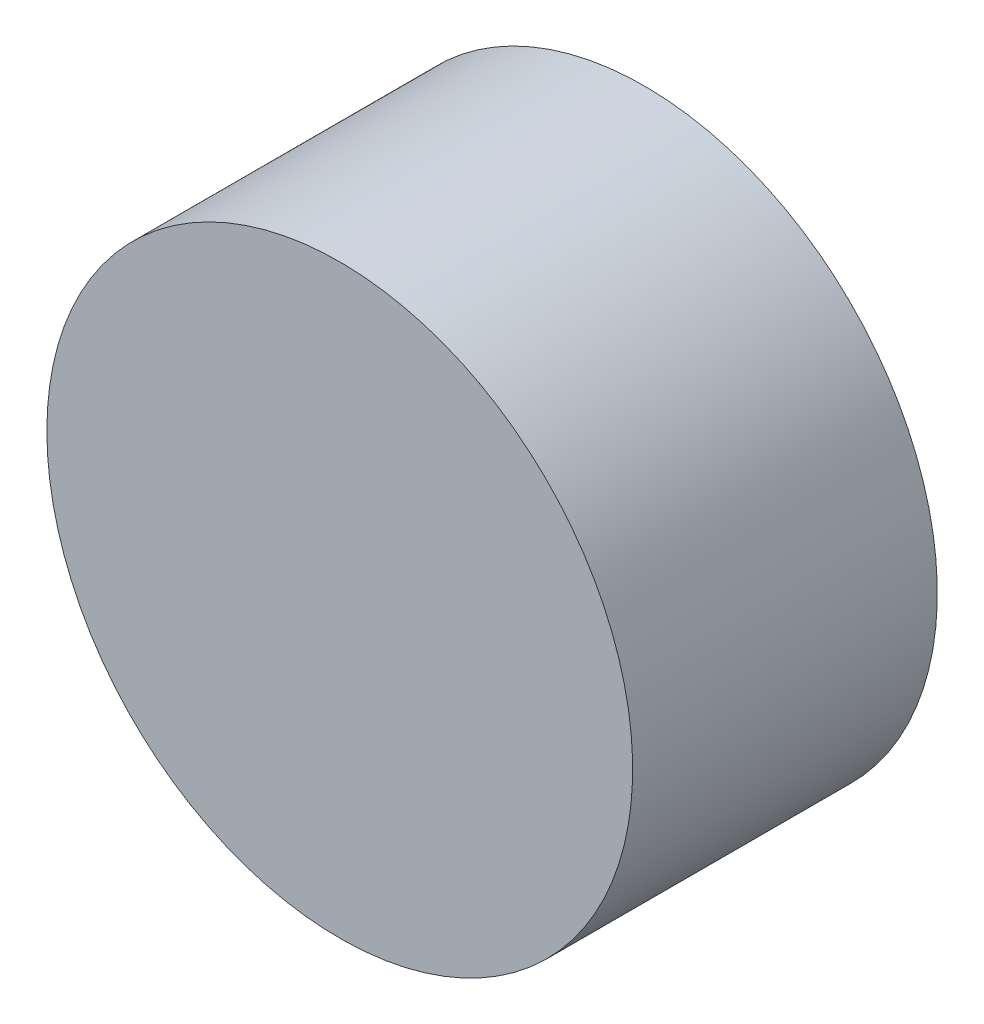
ISO-10303-21;
HEADER;
FILE_DESCRIPTION(('STEP AP214'),'2;1');
FILE_NAME('part.step','',(''),(''),'','','');
FILE_SCHEMA(('AUTOMOTIVE_DESIGN { 1 0 10303 214 1 1 1 1 }'));
ENDSEC;
DATA;
#1=APPLICATION_CONTEXT('core data for automotive mechanical design processes');
#2=APPLICATION_PROTOCOL_DEFINITION('international standard','automotive_design',2000,#1);
#3=PRODUCT_CONTEXT('',#1,'mechanical');
#4=PRODUCT('Part','Part','',(#3));
#5=PRODUCT_RELATED_PRODUCT_CATEGORY('part','',(#4));
#6=PRODUCT_DEFINITION_FORMATION('','',#4);
#7=PRODUCT_DEFINITION_CONTEXT('part definition',#1,'design');
#8=PRODUCT_DEFINITION('design','',#6,#7);
#9=PRODUCT_DEFINITION_SHAPE('','',#8);
#10=(LENGTH_UNIT() NAMED_UNIT(*) SI_UNIT(.MILLI.,.METRE.));
#11=(NAMED_UNIT(*) PLANE_ANGLE_UNIT() SI_UNIT($,.RADIAN.));
#12=(NAMED_UNIT(*) SI_UNIT($,.STERADIAN.) SOLID_ANGLE_UNIT());
#13=UNCERTAINTY_MEASURE_WITH_UNIT(LENGTH_MEASURE(1.E-05),#10,'distance_accuracy_value','');
#14=(GEOMETRIC_REPRESENTATION_CONTEXT(3) GLOBAL_UNCERTAINTY_ASSIGNED_CONTEXT((#13)) GLOBAL_UNIT_ASSIGNED_CONTEXT((#10,
#11,#12)) REPRESENTATION_CONTEXT('',''));
#15=CARTESIAN_POINT('',(0.,0.,0.));
#16=DIRECTION('',(0.,0.,1.));
#17=DIRECTION('',(1.,0.,0.));
#18=AXIS2_PLACEMENT_3D('',#15,#16,#17);
#19=CARTESIAN_POINT('',(0.,0.,13.));
#20=DIRECTION('',(0.,0.,-1.));
#21=DIRECTION('',(-1.,0.,0.));
#22=AXIS2_PLACEMENT_3D('',#19,#20,#21);
#23=CYLINDRICAL_SURFACE('',#22,12.5);
#24=CARTESIAN_POINT('',(0.,0.,13.));
#25=DIRECTION('',(0.,0.,1.));
#26=DIRECTION('',(1.,0.,0.));
#27=AXIS2_PLACEMENT_3D('',#24,#25,#26);
#28=CIRCLE('',#27,12.5);
#29=CARTESIAN_POINT('',(-12.5,0.,13.));
#30=VERTEX_POINT('',#29);
#31=EDGE_CURVE('E10',#30,#30,#28,.T.);
#32=CARTESIAN_POINT('',(0.,0.,0.));
#33=DIRECTION('',(0.,0.,1.));
#34=DIRECTION('',(1.,0.,0.));
#35=AXIS2_PLACEMENT_3D('',#32,#33,#34);
#36=CIRCLE('',#35,12.5);
#37=CARTESIAN_POINT('',(-12.5,0.,0.));
#38=VERTEX_POINT('',#37);
#39=EDGE_CURVE('E41',#38,#38,#36,.T.);
#40=CARTESIAN_POINT('',(-12.5,0.,13.));
#41=CARTESIAN_POINT('',(-12.5,0.,12.8645833333333));
#42=CARTESIAN_POINT('',(-12.5,0.,12.7291666666667));
#43=CARTESIAN_POINT('',(-12.5,0.,12.4583333333333));
#44=CARTESIAN_POINT('',(-12.5,0.,12.3229166666667));
#45=CARTESIAN_POINT('',(-12.5,0.,12.0520833333333));
#46=CARTESIAN_POINT('',(-12.5,0.,11.9166666666667));
#47=CARTESIAN_POINT('',(-12.5,0.,11.6458333333333));
#48=CARTESIAN_POINT('',(-12.5,0.,11.5104166666667));
#49=CARTESIAN_POINT('',(-12.5,0.,11.2395833333333));
#50=CARTESIAN_POINT('',(-12.5,0.,11.1041666666667));
#51=CARTESIAN_POINT('',(-12.5,0.,10.8333333333333));
#52=CARTESIAN_POINT('',(-12.5,0.,10.6979166666667));
#53=CARTESIAN_POINT('',(-12.5,0.,10.4270833333333));
#54=CARTESIAN_POINT('',(-12.5,0.,10.2916666666667));
#55=CARTESIAN_POINT('',(-12.5,0.,10.0208333333333));
#56=CARTESIAN_POINT('',(-12.5,0.,9.88541666666667));
#57=CARTESIAN_POINT('',(-12.5,0.,9.61458333333333));
#58=CARTESIAN_POINT('',(-12.5,0.,9.47916666666667));
#59=CARTESIAN_POINT('',(-12.5,0.,9.20833333333333));
#60=CARTESIAN_POINT('',(-12.5,0.,9.07291666666666));
#61=CARTESIAN_POINT('',(-12.5,0.,8.80208333333333));
#62=CARTESIAN_POINT('',(-12.5,0.,8.66666666666667));
#63=CARTESIAN_POINT('',(-12.5,0.,8.39583333333333));
#64=CARTESIAN_POINT('',(-12.5,0.,8.26041666666667));
#65=CARTESIAN_POINT('',(-12.5,0.,7.98958333333333));
#66=CARTESIAN_POINT('',(-12.5,0.,7.85416666666667));
#67=CARTESIAN_POINT('',(-12.5,0.,7.58333333333333));
#68=CARTESIAN_POINT('',(-12.5,0.,7.44791666666667));
#69=CARTESIAN_POINT('',(-12.5,0.,7.17708333333333));
#70=CARTESIAN_POINT('',(-12.5,0.,7.04166666666667));
#71=CARTESIAN_POINT('',(-12.5,0.,6.77083333333333));
#72=CARTESIAN_POINT('',(-12.5,0.,6.63541666666667));
#73=CARTESIAN_POINT('',(-12.5,0.,6.36458333333333));
#74=CARTESIAN_POINT('',(-12.5,0.,6.22916666666667));
#75=CARTESIAN_POINT('',(-12.5,0.,5.95833333333333));
#76=CARTESIAN_POINT('',(-12.5,0.,5.82291666666667));
#77=CARTESIAN_POINT('',(-12.5,0.,5.55208333333333));
#78=CARTESIAN_POINT('',(-12.5,0.,5.41666666666667));
#79=CARTESIAN_POINT('',(-12.5,0.,5.14583333333333));
#80=CARTESIAN_POINT('',(-12.5,0.,5.01041666666667));
#81=CARTESIAN_POINT('',(-12.5,0.,4.73958333333333));
#82=CARTESIAN_POINT('',(-12.5,0.,4.60416666666667));
#83=CARTESIAN_POINT('',(-12.5,0.,4.33333333333333));
#84=CARTESIAN_POINT('',(-12.5,0.,4.19791666666667));
#85=CARTESIAN_POINT('',(-12.5,0.,3.92708333333333));
#86=CARTESIAN_POINT('',(-12.5,0.,3.79166666666667));
#87=CARTESIAN_POINT('',(-12.5,0.,3.52083333333333));
#88=CARTESIAN_POINT('',(-12.5,0.,3.38541666666667));
#89=CARTESIAN_POINT('',(-12.5,0.,3.11458333333333));
#90=CARTESIAN_POINT('',(-12.5,0.,2.97916666666667));
#91=CARTESIAN_POINT('',(-12.5,0.,2.70833333333333));
#92=CARTESIAN_POINT('',(-12.5,0.,2.57291666666667));
#93=CARTESIAN_POINT('',(-12.5,0.,2.30208333333333));
#94=CARTESIAN_POINT('',(-12.5,0.,2.16666666666667));
#95=CARTESIAN_POINT('',(-12.5,0.,1.89583333333333));
#96=CARTESIAN_POINT('',(-12.5,0.,1.76041666666667));
#97=CARTESIAN_POINT('',(-12.5,0.,1.48958333333333));
#98=CARTESIAN_POINT('',(-12.5,0.,1.35416666666667));
#99=CARTESIAN_POINT('',(-12.5,0.,1.08333333333333));
#100=CARTESIAN_POINT('',(-12.5,0.,0.947916666666667));
#101=CARTESIAN_POINT('',(-12.5,0.,0.677083333333334));
#102=CARTESIAN_POINT('',(-12.5,0.,0.541666666666667));
#103=CARTESIAN_POINT('',(-12.5,0.,0.270833333333334));
#104=CARTESIAN_POINT('',(-12.5,0.,0.135416666666667));
#105=CARTESIAN_POINT('',(-12.5,0.,0.));
#106=B_SPLINE_CURVE_WITH_KNOTS('',3,(#40,#41,#42,#43,#44,#45,#46,#47,#48,#49,#50,#51,#52,#53,
#54,#55,#56,#57,#58,#59,#60,#61,#62,#63,#64,#65,#66,#67,#68,#69,#70,#71,#72,#73,#74,#75,#76,#77,
#78,#79,#80,#81,#82,#83,#84,#85,#86,#87,#88,#89,#90,#91,#92,#93,#94,#95,#96,#97,#98,#99,#100,
#101,#102,#103,#104,#105),.UNSPECIFIED.,.F.,.F.,(4,2,2,2,2,2,2,2,2,2,2,2,2,2,2,2,2,2,2,2,2,2,2,
2,2,2,2,2,2,2,2,2,4),(0.,0.40625,0.812500000000001,1.21875,1.625,2.03125,2.4375,2.84375,3.25,
3.65625,4.0625,4.46875,4.875,5.28125,5.6875,6.09375,6.5,6.90625,7.3125,7.71875,8.125,8.53125,
8.9375,9.34375,9.75,10.15625,10.5625,10.96875,11.375,11.78125,12.1875,12.59375,13.),.UNSPECIFIED.);
#107=EDGE_CURVE('BSEAM38',#30,#38,#106,.T.);
#108=ORIENTED_EDGE('',*,*,#31,.F.);
#109=ORIENTED_EDGE('',*,*,#39,.T.);
#110=ORIENTED_EDGE('',*,*,#107,.T.);
#111=ORIENTED_EDGE('',*,*,#107,.F.);
#112=EDGE_LOOP('',(#108,#110,#109,#111));
#113=FACE_BOUND('',#112,.T.);
#114=ADVANCED_FACE('F38',(#113),#23,.T.);
#115=CARTESIAN_POINT('',(0.,0.,13.));
#116=DIRECTION('',(0.,0.,1.));
#117=DIRECTION('',(1.,0.,0.));
#118=AXIS2_PLACEMENT_3D('',#115,#116,#117);
#119=PLANE('',#118);
#120=ORIENTED_EDGE('',*,*,#31,.T.);
#121=EDGE_LOOP('',(#120));
#122=FACE_BOUND('',#121,.T.);
#123=ADVANCED_FACE('F67',(#122),#119,.T.);
#124=CARTESIAN_POINT('',(0.,0.,0.));
#125=DIRECTION('',(0.,0.,1.));
#126=DIRECTION('',(1.,0.,0.));
#127=AXIS2_PLACEMENT_3D('',#124,#125,#126);
#128=PLANE('',#127);
#129=CARTESIAN_POINT('',(0.,0.,0.));
#130=DIRECTION('',(0.,0.,-1.));
#131=DIRECTION('',(-1.,0.,0.));
#132=AXIS2_PLACEMENT_3D('',#129,#130,#131);
#133=CIRCLE('',#132,3.175);
#134=CARTESIAN_POINT('',(-3.175,0.,0.));
#135=VERTEX_POINT('',#134);
#136=EDGE_CURVE('E50',#135,#135,#133,.T.);
#137=ORIENTED_EDGE('',*,*,#136,.F.);
#138=EDGE_LOOP('',(#137));
#139=FACE_BOUND('',#138,.T.);
#140=ORIENTED_EDGE('',*,*,#39,.F.);
#141=EDGE_LOOP('',(#140));
#142=FACE_BOUND('',#141,.T.);
#143=ADVANCED_FACE('F61',(#139,#142),#128,.F.);
#144=CARTESIAN_POINT('',(0.,0.,12.));
#145=DIRECTION('',(0.,0.,-1.));
#146=DIRECTION('',(-1.,0.,0.));
#147=AXIS2_PLACEMENT_3D('',#144,#145,#146);
#148=CYLINDRICAL_SURFACE('',#147,3.175);
#149=CARTESIAN_POINT('',(0.,0.,12.));
#150=DIRECTION('',(0.,0.,-1.));
#151=DIRECTION('',(-1.,0.,0.));
#152=AXIS2_PLACEMENT_3D('',#149,#150,#151);
#153=CIRCLE('',#152,3.175);
#154=CARTESIAN_POINT('',(-3.175,0.,12.));
#155=VERTEX_POINT('',#154);
#156=EDGE_CURVE('E48',#155,#155,#153,.T.);
#157=ORIENTED_EDGE('',*,*,#156,.F.);
#158=EDGE_LOOP('',(#157));
#159=FACE_BOUND('',#158,.T.);
#160=ORIENTED_EDGE('',*,*,#136,.T.);
#161=EDGE_LOOP('',(#160));
#162=FACE_BOUND('',#161,.T.);
#163=ADVANCED_FACE('F58',(#159,#162),#148,.F.);
#164=CARTESIAN_POINT('',(0.,0.,12.));
#165=DIRECTION('',(0.,0.,-1.));
#166=DIRECTION('',(-1.,0.,0.));
#167=AXIS2_PLACEMENT_3D('',#164,#165,#166);
#168=PLANE('',#167);
#169=ORIENTED_EDGE('',*,*,#156,.T.);
#170=EDGE_LOOP('',(#169));
#171=FACE_BOUND('',#170,.T.);
#172=ADVANCED_FACE('F56',(#171),#168,.T.);
#173=CLOSED_SHELL('',(#114,#123,#143,#163,#172));
#174=MANIFOLD_SOLID_BREP('B2',#173);
#175=ADVANCED_BREP_SHAPE_REPRESENTATION('',(#18,#174),#14);
#176=SHAPE_DEFINITION_REPRESENTATION(#9,#175);
ENDSEC;
END-ISO-10303-21;
